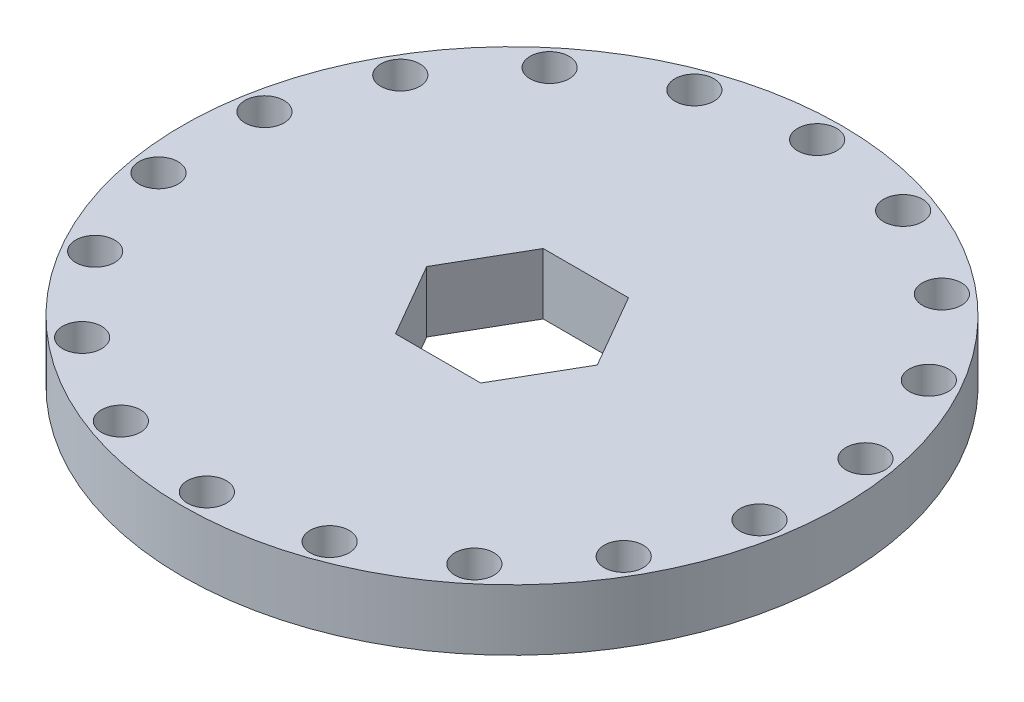
ISO-10303-21;
HEADER;
FILE_DESCRIPTION(('STEP AP214'),'2;1');
FILE_NAME('part.step','',(''),(''),'','','');
FILE_SCHEMA(('AUTOMOTIVE_DESIGN { 1 0 10303 214 1 1 1 1 }'));
ENDSEC;
DATA;
#1=APPLICATION_CONTEXT('core data for automotive mechanical design processes');
#2=APPLICATION_PROTOCOL_DEFINITION('international standard','automotive_design',2000,#1);
#3=PRODUCT_CONTEXT('',#1,'mechanical');
#4=PRODUCT('Part','Part','',(#3));
#5=PRODUCT_RELATED_PRODUCT_CATEGORY('part','',(#4));
#6=PRODUCT_DEFINITION_FORMATION('','',#4);
#7=PRODUCT_DEFINITION_CONTEXT('part definition',#1,'design');
#8=PRODUCT_DEFINITION('design','',#6,#7);
#9=PRODUCT_DEFINITION_SHAPE('','',#8);
#10=(LENGTH_UNIT() NAMED_UNIT(*) SI_UNIT(.MILLI.,.METRE.));
#11=(NAMED_UNIT(*) PLANE_ANGLE_UNIT() SI_UNIT($,.RADIAN.));
#12=(NAMED_UNIT(*) SI_UNIT($,.STERADIAN.) SOLID_ANGLE_UNIT());
#13=UNCERTAINTY_MEASURE_WITH_UNIT(LENGTH_MEASURE(1.E-05),#10,'distance_accuracy_value','');
#14=(GEOMETRIC_REPRESENTATION_CONTEXT(3) GLOBAL_UNCERTAINTY_ASSIGNED_CONTEXT((#13)) GLOBAL_UNIT_ASSIGNED_CONTEXT((#10,
#11,#12)) REPRESENTATION_CONTEXT('',''));
#15=CARTESIAN_POINT('',(0.,0.,0.));
#16=DIRECTION('',(0.,0.,1.));
#17=DIRECTION('',(1.,0.,0.));
#18=AXIS2_PLACEMENT_3D('',#15,#16,#17);
#19=CARTESIAN_POINT('',(0.,5.,0.));
#20=DIRECTION('',(0.,-1.,0.));
#21=DIRECTION('',(0.,0.,-1.));
#22=AXIS2_PLACEMENT_3D('',#19,#20,#21);
#23=CYLINDRICAL_SURFACE('',#22,27.);
#24=CARTESIAN_POINT('',(0.,5.,0.));
#25=DIRECTION('',(0.,1.,0.));
#26=DIRECTION('',(0.,0.,1.));
#27=AXIS2_PLACEMENT_3D('',#24,#25,#26);
#28=CIRCLE('',#27,27.);
#29=CARTESIAN_POINT('',(0.,5.,27.));
#30=VERTEX_POINT('',#29);
#31=EDGE_CURVE('E11',#30,#30,#28,.T.);
#32=ORIENTED_EDGE('',*,*,#31,.F.);
#33=EDGE_LOOP('',(#32));
#34=FACE_BOUND('',#33,.T.);
#35=CARTESIAN_POINT('',(0.,0.,0.));
#36=DIRECTION('',(0.,1.,0.));
#37=DIRECTION('',(0.,0.,1.));
#38=AXIS2_PLACEMENT_3D('',#35,#36,#37);
#39=CIRCLE('',#38,27.);
#40=CARTESIAN_POINT('',(0.,0.,27.));
#41=VERTEX_POINT('',#40);
#42=EDGE_CURVE('E45',#41,#41,#39,.T.);
#43=ORIENTED_EDGE('',*,*,#42,.T.);
#44=EDGE_LOOP('',(#43));
#45=FACE_BOUND('',#44,.T.);
#46=ADVANCED_FACE('F37',(#34,#45),#23,.T.);
#47=CARTESIAN_POINT('',(0.,5.,0.));
#48=DIRECTION('',(0.,1.,0.));
#49=DIRECTION('',(0.,0.,1.));
#50=AXIS2_PLACEMENT_3D('',#47,#48,#49);
#51=PLANE('',#50);
#52=CARTESIAN_POINT('',(-8.55050358314172,5.,-23.4923155196477));
#53=DIRECTION('',(0.,1.,0.));
#54=DIRECTION('',(0.,0.,1.));
#55=AXIS2_PLACEMENT_3D('',#52,#53,#54);
#56=CIRCLE('',#55,1.6);
#57=CARTESIAN_POINT('',(-8.55050358314172,5.,-21.8923155196477));
#58=VERTEX_POINT('',#57);
#59=EDGE_CURVE('E222',#58,#58,#56,.T.);
#60=ORIENTED_EDGE('',*,*,#59,.F.);
#61=EDGE_LOOP('',(#60));
#62=FACE_BOUND('',#61,.T.);
#63=CARTESIAN_POINT('',(-16.0696902421635,5.,-19.1511110779744));
#64=DIRECTION('',(0.,1.,0.));
#65=DIRECTION('',(0.,0.,1.));
#66=AXIS2_PLACEMENT_3D('',#63,#64,#65);
#67=CIRCLE('',#66,1.6);
#68=CARTESIAN_POINT('',(-16.0696902421635,5.,-17.5511110779744));
#69=VERTEX_POINT('',#68);
#70=EDGE_CURVE('E212',#69,#69,#67,.T.);
#71=ORIENTED_EDGE('',*,*,#70,.F.);
#72=EDGE_LOOP('',(#71));
#73=FACE_BOUND('',#72,.T.);
#74=CARTESIAN_POINT('',(-21.650635094611,5.,-12.5));
#75=DIRECTION('',(0.,1.,0.));
#76=DIRECTION('',(0.,0.,1.));
#77=AXIS2_PLACEMENT_3D('',#74,#75,#76);
#78=CIRCLE('',#77,1.6);
#79=CARTESIAN_POINT('',(-21.650635094611,5.,-10.9));
#80=VERTEX_POINT('',#79);
#81=EDGE_CURVE('E209',#80,#80,#78,.T.);
#82=ORIENTED_EDGE('',*,*,#81,.F.);
#83=EDGE_LOOP('',(#82));
#84=FACE_BOUND('',#83,.T.);
#85=CARTESIAN_POINT('',(-24.6201938253052,5.,-4.34120444167325));
#86=DIRECTION('',(0.,1.,0.));
#87=DIRECTION('',(0.,0.,1.));
#88=AXIS2_PLACEMENT_3D('',#85,#86,#87);
#89=CIRCLE('',#88,1.6);
#90=CARTESIAN_POINT('',(-24.6201938253052,5.,-2.74120444167325));
#91=VERTEX_POINT('',#90);
#92=EDGE_CURVE('E206',#91,#91,#89,.T.);
#93=ORIENTED_EDGE('',*,*,#92,.F.);
#94=EDGE_LOOP('',(#93));
#95=FACE_BOUND('',#94,.T.);
#96=CARTESIAN_POINT('',(-24.6201938253052,5.,4.34120444167328));
#97=DIRECTION('',(0.,1.,0.));
#98=DIRECTION('',(0.,0.,1.));
#99=AXIS2_PLACEMENT_3D('',#96,#97,#98);
#100=CIRCLE('',#99,1.6);
#101=CARTESIAN_POINT('',(-24.6201938253052,5.,5.94120444167328));
#102=VERTEX_POINT('',#101);
#103=EDGE_CURVE('E202',#102,#102,#100,.T.);
#104=ORIENTED_EDGE('',*,*,#103,.F.);
#105=EDGE_LOOP('',(#104));
#106=FACE_BOUND('',#105,.T.);
#107=CARTESIAN_POINT('',(-21.650635094611,5.,12.5));
#108=DIRECTION('',(0.,1.,0.));
#109=DIRECTION('',(0.,0.,1.));
#110=AXIS2_PLACEMENT_3D('',#107,#108,#109);
#111=CIRCLE('',#110,1.6);
#112=CARTESIAN_POINT('',(-21.650635094611,5.,14.1));
#113=VERTEX_POINT('',#112);
#114=EDGE_CURVE('E198',#113,#113,#111,.T.);
#115=ORIENTED_EDGE('',*,*,#114,.F.);
#116=EDGE_LOOP('',(#115));
#117=FACE_BOUND('',#116,.T.);
#118=CARTESIAN_POINT('',(-16.0696902421635,5.,19.1511110779745));
#119=DIRECTION('',(0.,1.,0.));
#120=DIRECTION('',(0.,0.,1.));
#121=AXIS2_PLACEMENT_3D('',#118,#119,#120);
#122=CIRCLE('',#121,1.6);
#123=CARTESIAN_POINT('',(-16.0696902421635,5.,20.7511110779745));
#124=VERTEX_POINT('',#123);
#125=EDGE_CURVE('E194',#124,#124,#122,.T.);
#126=ORIENTED_EDGE('',*,*,#125,.F.);
#127=EDGE_LOOP('',(#126));
#128=FACE_BOUND('',#127,.T.);
#129=CARTESIAN_POINT('',(-8.55050358314171,5.,23.4923155196477));
#130=DIRECTION('',(0.,1.,0.));
#131=DIRECTION('',(0.,0.,1.));
#132=AXIS2_PLACEMENT_3D('',#129,#130,#131);
#133=CIRCLE('',#132,1.6);
#134=CARTESIAN_POINT('',(-8.55050358314171,5.,25.0923155196477));
#135=VERTEX_POINT('',#134);
#136=EDGE_CURVE('E190',#135,#135,#133,.T.);
#137=ORIENTED_EDGE('',*,*,#136,.F.);
#138=EDGE_LOOP('',(#137));
#139=FACE_BOUND('',#138,.T.);
#140=CARTESIAN_POINT('',(0.,5.,25.));
#141=DIRECTION('',(0.,1.,0.));
#142=DIRECTION('',(0.,0.,1.));
#143=AXIS2_PLACEMENT_3D('',#140,#141,#142);
#144=CIRCLE('',#143,1.6);
#145=CARTESIAN_POINT('',(0.,5.,26.6));
#146=VERTEX_POINT('',#145);
#147=EDGE_CURVE('E186',#146,#146,#144,.T.);
#148=ORIENTED_EDGE('',*,*,#147,.F.);
#149=EDGE_LOOP('',(#148));
#150=FACE_BOUND('',#149,.T.);
#151=CARTESIAN_POINT('',(8.55050358314173,5.,23.4923155196477));
#152=DIRECTION('',(0.,1.,0.));
#153=DIRECTION('',(0.,0.,1.));
#154=AXIS2_PLACEMENT_3D('',#151,#152,#153);
#155=CIRCLE('',#154,1.6);
#156=CARTESIAN_POINT('',(8.55050358314173,5.,25.0923155196477));
#157=VERTEX_POINT('',#156);
#158=EDGE_CURVE('E182',#157,#157,#155,.T.);
#159=ORIENTED_EDGE('',*,*,#158,.F.);
#160=EDGE_LOOP('',(#159));
#161=FACE_BOUND('',#160,.T.);
#162=CARTESIAN_POINT('',(16.0696902421635,5.,19.1511110779745));
#163=DIRECTION('',(0.,1.,0.));
#164=DIRECTION('',(0.,0.,1.));
#165=AXIS2_PLACEMENT_3D('',#162,#163,#164);
#166=CIRCLE('',#165,1.6);
#167=CARTESIAN_POINT('',(16.0696902421635,5.,20.7511110779745));
#168=VERTEX_POINT('',#167);
#169=EDGE_CURVE('E178',#168,#168,#166,.T.);
#170=ORIENTED_EDGE('',*,*,#169,.F.);
#171=EDGE_LOOP('',(#170));
#172=FACE_BOUND('',#171,.T.);
#173=CARTESIAN_POINT('',(21.650635094611,5.,12.5));
#174=DIRECTION('',(0.,1.,0.));
#175=DIRECTION('',(0.,0.,1.));
#176=AXIS2_PLACEMENT_3D('',#173,#174,#175);
#177=CIRCLE('',#176,1.6);
#178=CARTESIAN_POINT('',(21.650635094611,5.,14.1));
#179=VERTEX_POINT('',#178);
#180=EDGE_CURVE('E174',#179,#179,#177,.T.);
#181=ORIENTED_EDGE('',*,*,#180,.F.);
#182=EDGE_LOOP('',(#181));
#183=FACE_BOUND('',#182,.T.);
#184=CARTESIAN_POINT('',(24.6201938253052,5.,4.34120444167326));
#185=DIRECTION('',(0.,1.,0.));
#186=DIRECTION('',(0.,0.,1.));
#187=AXIS2_PLACEMENT_3D('',#184,#185,#186);
#188=CIRCLE('',#187,1.6);
#189=CARTESIAN_POINT('',(24.6201938253052,5.,5.94120444167326));
#190=VERTEX_POINT('',#189);
#191=EDGE_CURVE('E170',#190,#190,#188,.T.);
#192=ORIENTED_EDGE('',*,*,#191,.F.);
#193=EDGE_LOOP('',(#192));
#194=FACE_BOUND('',#193,.T.);
#195=CARTESIAN_POINT('',(24.6201938253052,5.,-4.34120444167327));
#196=DIRECTION('',(0.,1.,0.));
#197=DIRECTION('',(0.,0.,1.));
#198=AXIS2_PLACEMENT_3D('',#195,#196,#197);
#199=CIRCLE('',#198,1.6);
#200=CARTESIAN_POINT('',(24.6201938253052,5.,-2.74120444167327));
#201=VERTEX_POINT('',#200);
#202=EDGE_CURVE('E166',#201,#201,#199,.T.);
#203=ORIENTED_EDGE('',*,*,#202,.F.);
#204=EDGE_LOOP('',(#203));
#205=FACE_BOUND('',#204,.T.);
#206=CARTESIAN_POINT('',(21.650635094611,5.,-12.5));
#207=DIRECTION('',(0.,1.,0.));
#208=DIRECTION('',(0.,0.,1.));
#209=AXIS2_PLACEMENT_3D('',#206,#207,#208);
#210=CIRCLE('',#209,1.6);
#211=CARTESIAN_POINT('',(21.650635094611,5.,-10.9));
#212=VERTEX_POINT('',#211);
#213=EDGE_CURVE('E162',#212,#212,#210,.T.);
#214=ORIENTED_EDGE('',*,*,#213,.F.);
#215=EDGE_LOOP('',(#214));
#216=FACE_BOUND('',#215,.T.);
#217=CARTESIAN_POINT('',(16.0696902421635,5.,-19.1511110779745));
#218=DIRECTION('',(0.,1.,0.));
#219=DIRECTION('',(0.,0.,1.));
#220=AXIS2_PLACEMENT_3D('',#217,#218,#219);
#221=CIRCLE('',#220,1.6);
#222=CARTESIAN_POINT('',(16.0696902421635,5.,-17.5511110779745));
#223=VERTEX_POINT('',#222);
#224=EDGE_CURVE('E158',#223,#223,#221,.T.);
#225=ORIENTED_EDGE('',*,*,#224,.F.);
#226=EDGE_LOOP('',(#225));
#227=FACE_BOUND('',#226,.T.);
#228=CARTESIAN_POINT('',(8.55050358314173,5.,-23.4923155196477));
#229=DIRECTION('',(0.,1.,0.));
#230=DIRECTION('',(0.,0.,1.));
#231=AXIS2_PLACEMENT_3D('',#228,#229,#230);
#232=CIRCLE('',#231,1.6);
#233=CARTESIAN_POINT('',(8.55050358314173,5.,-21.8923155196477));
#234=VERTEX_POINT('',#233);
#235=EDGE_CURVE('E154',#234,#234,#232,.T.);
#236=ORIENTED_EDGE('',*,*,#235,.F.);
#237=EDGE_LOOP('',(#236));
#238=FACE_BOUND('',#237,.T.);
#239=CARTESIAN_POINT('',(0.,5.,-25.));
#240=DIRECTION('',(0.,1.,0.));
#241=DIRECTION('',(0.,0.,1.));
#242=AXIS2_PLACEMENT_3D('',#239,#240,#241);
#243=CIRCLE('',#242,1.6);
#244=CARTESIAN_POINT('',(0.,5.,-23.4));
#245=VERTEX_POINT('',#244);
#246=EDGE_CURVE('E116',#245,#245,#243,.T.);
#247=ORIENTED_EDGE('',*,*,#246,.F.);
#248=EDGE_LOOP('',(#247));
#249=FACE_BOUND('',#248,.T.);
#250=DIRECTION('',(0.5,0.,0.866025403784439));
#251=VECTOR('',#250,1.);
#252=CARTESIAN_POINT('',(-6.98593825719447,5.,0.));
#253=LINE('',#252,#251);
#254=CARTESIAN_POINT('',(-6.98593825719447,5.,0.));
#255=VERTEX_POINT('',#254);
#256=CARTESIAN_POINT('',(-3.49296912859724,5.,6.05));
#257=VERTEX_POINT('',#256);
#258=EDGE_CURVE('E53',#255,#257,#253,.T.);
#259=ORIENTED_EDGE('',*,*,#258,.F.);
#260=DIRECTION('',(-0.5,0.,0.866025403784439));
#261=VECTOR('',#260,1.);
#262=CARTESIAN_POINT('',(-3.49296912859724,5.,-6.05));
#263=LINE('',#262,#261);
#264=CARTESIAN_POINT('',(-3.49296912859724,5.,-6.05));
#265=VERTEX_POINT('',#264);
#266=EDGE_CURVE('E110',#265,#255,#263,.T.);
#267=ORIENTED_EDGE('',*,*,#266,.F.);
#268=DIRECTION('',(-1.,0.,0.));
#269=VECTOR('',#268,1.);
#270=CARTESIAN_POINT('',(3.49296912859723,5.,-6.05));
#271=LINE('',#270,#269);
#272=CARTESIAN_POINT('',(3.49296912859723,5.,-6.05));
#273=VERTEX_POINT('',#272);
#274=EDGE_CURVE('E113',#273,#265,#271,.T.);
#275=ORIENTED_EDGE('',*,*,#274,.F.);
#276=DIRECTION('',(-0.5,0.,-0.866025403784439));
#277=VECTOR('',#276,1.);
#278=CARTESIAN_POINT('',(6.98593825719447,5.,0.));
#279=LINE('',#278,#277);
#280=CARTESIAN_POINT('',(6.98593825719447,5.,0.));
#281=VERTEX_POINT('',#280);
#282=EDGE_CURVE('E133',#281,#273,#279,.T.);
#283=ORIENTED_EDGE('',*,*,#282,.F.);
#284=DIRECTION('',(0.5,0.,-0.866025403784439));
#285=VECTOR('',#284,1.);
#286=CARTESIAN_POINT('',(3.49296912859723,5.,6.05));
#287=LINE('',#286,#285);
#288=CARTESIAN_POINT('',(3.49296912859723,5.,6.05));
#289=VERTEX_POINT('',#288);
#290=EDGE_CURVE('E130',#289,#281,#287,.T.);
#291=ORIENTED_EDGE('',*,*,#290,.F.);
#292=DIRECTION('',(1.,0.,0.));
#293=VECTOR('',#292,1.);
#294=CARTESIAN_POINT('',(-3.49296912859724,5.,6.05));
#295=LINE('',#294,#293);
#296=EDGE_CURVE('E127',#257,#289,#295,.T.);
#297=ORIENTED_EDGE('',*,*,#296,.F.);
#298=EDGE_LOOP('',(#259,#267,#275,#283,#291,#297));
#299=FACE_BOUND('',#298,.T.);
#300=ORIENTED_EDGE('',*,*,#31,.T.);
#301=EDGE_LOOP('',(#300));
#302=FACE_BOUND('',#301,.T.);
#303=ADVANCED_FACE('F256',(#62,#73,#84,#95,#106,#117,#128,#139,#150,#161,#172,#183,#194,#205,
#216,#227,#238,#249,#299,#302),#51,.T.);
#304=CARTESIAN_POINT('',(0.,0.,0.));
#305=DIRECTION('',(0.,1.,0.));
#306=DIRECTION('',(0.,0.,1.));
#307=AXIS2_PLACEMENT_3D('',#304,#305,#306);
#308=PLANE('',#307);
#309=CARTESIAN_POINT('',(-8.55050358314172,0.,-23.4923155196477));
#310=DIRECTION('',(0.,1.,0.));
#311=DIRECTION('',(0.,0.,1.));
#312=AXIS2_PLACEMENT_3D('',#309,#310,#311);
#313=CIRCLE('',#312,1.6);
#314=CARTESIAN_POINT('',(-8.55050358314172,0.,-21.8923155196477));
#315=VERTEX_POINT('',#314);
#316=EDGE_CURVE('E40',#315,#315,#313,.T.);
#317=ORIENTED_EDGE('',*,*,#316,.T.);
#318=EDGE_LOOP('',(#317));
#319=FACE_BOUND('',#318,.T.);
#320=CARTESIAN_POINT('',(-16.0696902421635,0.,-19.1511110779744));
#321=DIRECTION('',(0.,1.,0.));
#322=DIRECTION('',(0.,0.,1.));
#323=AXIS2_PLACEMENT_3D('',#320,#321,#322);
#324=CIRCLE('',#323,1.6);
#325=CARTESIAN_POINT('',(-16.0696902421635,0.,-17.5511110779744));
#326=VERTEX_POINT('',#325);
#327=EDGE_CURVE('E210',#326,#326,#324,.T.);
#328=ORIENTED_EDGE('',*,*,#327,.T.);
#329=EDGE_LOOP('',(#328));
#330=FACE_BOUND('',#329,.T.);
#331=CARTESIAN_POINT('',(-21.650635094611,0.,-12.5));
#332=DIRECTION('',(0.,1.,0.));
#333=DIRECTION('',(0.,0.,1.));
#334=AXIS2_PLACEMENT_3D('',#331,#332,#333);
#335=CIRCLE('',#334,1.6);
#336=CARTESIAN_POINT('',(-21.650635094611,0.,-10.9));
#337=VERTEX_POINT('',#336);
#338=EDGE_CURVE('E207',#337,#337,#335,.T.);
#339=ORIENTED_EDGE('',*,*,#338,.T.);
#340=EDGE_LOOP('',(#339));
#341=FACE_BOUND('',#340,.T.);
#342=CARTESIAN_POINT('',(-24.6201938253052,0.,-4.34120444167325));
#343=DIRECTION('',(0.,1.,0.));
#344=DIRECTION('',(0.,0.,1.));
#345=AXIS2_PLACEMENT_3D('',#342,#343,#344);
#346=CIRCLE('',#345,1.6);
#347=CARTESIAN_POINT('',(-24.6201938253052,0.,-2.74120444167325));
#348=VERTEX_POINT('',#347);
#349=EDGE_CURVE('E203',#348,#348,#346,.T.);
#350=ORIENTED_EDGE('',*,*,#349,.T.);
#351=EDGE_LOOP('',(#350));
#352=FACE_BOUND('',#351,.T.);
#353=CARTESIAN_POINT('',(-24.6201938253052,0.,4.34120444167328));
#354=DIRECTION('',(0.,1.,0.));
#355=DIRECTION('',(0.,0.,1.));
#356=AXIS2_PLACEMENT_3D('',#353,#354,#355);
#357=CIRCLE('',#356,1.6);
#358=CARTESIAN_POINT('',(-24.6201938253052,0.,5.94120444167328));
#359=VERTEX_POINT('',#358);
#360=EDGE_CURVE('E199',#359,#359,#357,.T.);
#361=ORIENTED_EDGE('',*,*,#360,.T.);
#362=EDGE_LOOP('',(#361));
#363=FACE_BOUND('',#362,.T.);
#364=CARTESIAN_POINT('',(-21.650635094611,0.,12.5));
#365=DIRECTION('',(0.,1.,0.));
#366=DIRECTION('',(0.,0.,1.));
#367=AXIS2_PLACEMENT_3D('',#364,#365,#366);
#368=CIRCLE('',#367,1.6);
#369=CARTESIAN_POINT('',(-21.650635094611,0.,14.1));
#370=VERTEX_POINT('',#369);
#371=EDGE_CURVE('E195',#370,#370,#368,.T.);
#372=ORIENTED_EDGE('',*,*,#371,.T.);
#373=EDGE_LOOP('',(#372));
#374=FACE_BOUND('',#373,.T.);
#375=CARTESIAN_POINT('',(-16.0696902421635,0.,19.1511110779745));
#376=DIRECTION('',(0.,1.,0.));
#377=DIRECTION('',(0.,0.,1.));
#378=AXIS2_PLACEMENT_3D('',#375,#376,#377);
#379=CIRCLE('',#378,1.6);
#380=CARTESIAN_POINT('',(-16.0696902421635,0.,20.7511110779745));
#381=VERTEX_POINT('',#380);
#382=EDGE_CURVE('E191',#381,#381,#379,.T.);
#383=ORIENTED_EDGE('',*,*,#382,.T.);
#384=EDGE_LOOP('',(#383));
#385=FACE_BOUND('',#384,.T.);
#386=CARTESIAN_POINT('',(-8.55050358314171,0.,23.4923155196477));
#387=DIRECTION('',(0.,1.,0.));
#388=DIRECTION('',(0.,0.,1.));
#389=AXIS2_PLACEMENT_3D('',#386,#387,#388);
#390=CIRCLE('',#389,1.6);
#391=CARTESIAN_POINT('',(-8.55050358314171,0.,25.0923155196477));
#392=VERTEX_POINT('',#391);
#393=EDGE_CURVE('E187',#392,#392,#390,.T.);
#394=ORIENTED_EDGE('',*,*,#393,.T.);
#395=EDGE_LOOP('',(#394));
#396=FACE_BOUND('',#395,.T.);
#397=CARTESIAN_POINT('',(0.,0.,25.));
#398=DIRECTION('',(0.,1.,0.));
#399=DIRECTION('',(0.,0.,1.));
#400=AXIS2_PLACEMENT_3D('',#397,#398,#399);
#401=CIRCLE('',#400,1.6);
#402=CARTESIAN_POINT('',(0.,0.,26.6));
#403=VERTEX_POINT('',#402);
#404=EDGE_CURVE('E183',#403,#403,#401,.T.);
#405=ORIENTED_EDGE('',*,*,#404,.T.);
#406=EDGE_LOOP('',(#405));
#407=FACE_BOUND('',#406,.T.);
#408=CARTESIAN_POINT('',(8.55050358314173,0.,23.4923155196477));
#409=DIRECTION('',(0.,1.,0.));
#410=DIRECTION('',(0.,0.,1.));
#411=AXIS2_PLACEMENT_3D('',#408,#409,#410);
#412=CIRCLE('',#411,1.6);
#413=CARTESIAN_POINT('',(8.55050358314173,0.,25.0923155196477));
#414=VERTEX_POINT('',#413);
#415=EDGE_CURVE('E179',#414,#414,#412,.T.);
#416=ORIENTED_EDGE('',*,*,#415,.T.);
#417=EDGE_LOOP('',(#416));
#418=FACE_BOUND('',#417,.T.);
#419=CARTESIAN_POINT('',(16.0696902421635,0.,19.1511110779745));
#420=DIRECTION('',(0.,1.,0.));
#421=DIRECTION('',(0.,0.,1.));
#422=AXIS2_PLACEMENT_3D('',#419,#420,#421);
#423=CIRCLE('',#422,1.6);
#424=CARTESIAN_POINT('',(16.0696902421635,0.,20.7511110779745));
#425=VERTEX_POINT('',#424);
#426=EDGE_CURVE('E175',#425,#425,#423,.T.);
#427=ORIENTED_EDGE('',*,*,#426,.T.);
#428=EDGE_LOOP('',(#427));
#429=FACE_BOUND('',#428,.T.);
#430=CARTESIAN_POINT('',(21.650635094611,0.,12.5));
#431=DIRECTION('',(0.,1.,0.));
#432=DIRECTION('',(0.,0.,1.));
#433=AXIS2_PLACEMENT_3D('',#430,#431,#432);
#434=CIRCLE('',#433,1.6);
#435=CARTESIAN_POINT('',(21.650635094611,0.,14.1));
#436=VERTEX_POINT('',#435);
#437=EDGE_CURVE('E171',#436,#436,#434,.T.);
#438=ORIENTED_EDGE('',*,*,#437,.T.);
#439=EDGE_LOOP('',(#438));
#440=FACE_BOUND('',#439,.T.);
#441=CARTESIAN_POINT('',(24.6201938253052,0.,4.34120444167326));
#442=DIRECTION('',(0.,1.,0.));
#443=DIRECTION('',(0.,0.,1.));
#444=AXIS2_PLACEMENT_3D('',#441,#442,#443);
#445=CIRCLE('',#444,1.6);
#446=CARTESIAN_POINT('',(24.6201938253052,0.,5.94120444167326));
#447=VERTEX_POINT('',#446);
#448=EDGE_CURVE('E167',#447,#447,#445,.T.);
#449=ORIENTED_EDGE('',*,*,#448,.T.);
#450=EDGE_LOOP('',(#449));
#451=FACE_BOUND('',#450,.T.);
#452=CARTESIAN_POINT('',(24.6201938253052,0.,-4.34120444167327));
#453=DIRECTION('',(0.,1.,0.));
#454=DIRECTION('',(0.,0.,1.));
#455=AXIS2_PLACEMENT_3D('',#452,#453,#454);
#456=CIRCLE('',#455,1.6);
#457=CARTESIAN_POINT('',(24.6201938253052,0.,-2.74120444167327));
#458=VERTEX_POINT('',#457);
#459=EDGE_CURVE('E163',#458,#458,#456,.T.);
#460=ORIENTED_EDGE('',*,*,#459,.T.);
#461=EDGE_LOOP('',(#460));
#462=FACE_BOUND('',#461,.T.);
#463=CARTESIAN_POINT('',(21.650635094611,0.,-12.5));
#464=DIRECTION('',(0.,1.,0.));
#465=DIRECTION('',(0.,0.,1.));
#466=AXIS2_PLACEMENT_3D('',#463,#464,#465);
#467=CIRCLE('',#466,1.6);
#468=CARTESIAN_POINT('',(21.650635094611,0.,-10.9));
#469=VERTEX_POINT('',#468);
#470=EDGE_CURVE('E159',#469,#469,#467,.T.);
#471=ORIENTED_EDGE('',*,*,#470,.T.);
#472=EDGE_LOOP('',(#471));
#473=FACE_BOUND('',#472,.T.);
#474=CARTESIAN_POINT('',(16.0696902421635,0.,-19.1511110779745));
#475=DIRECTION('',(0.,1.,0.));
#476=DIRECTION('',(0.,0.,1.));
#477=AXIS2_PLACEMENT_3D('',#474,#475,#476);
#478=CIRCLE('',#477,1.6);
#479=CARTESIAN_POINT('',(16.0696902421635,0.,-17.5511110779745));
#480=VERTEX_POINT('',#479);
#481=EDGE_CURVE('E155',#480,#480,#478,.T.);
#482=ORIENTED_EDGE('',*,*,#481,.T.);
#483=EDGE_LOOP('',(#482));
#484=FACE_BOUND('',#483,.T.);
#485=CARTESIAN_POINT('',(8.55050358314173,0.,-23.4923155196477));
#486=DIRECTION('',(0.,1.,0.));
#487=DIRECTION('',(0.,0.,1.));
#488=AXIS2_PLACEMENT_3D('',#485,#486,#487);
#489=CIRCLE('',#488,1.6);
#490=CARTESIAN_POINT('',(8.55050358314173,0.,-21.8923155196477));
#491=VERTEX_POINT('',#490);
#492=EDGE_CURVE('E151',#491,#491,#489,.T.);
#493=ORIENTED_EDGE('',*,*,#492,.T.);
#494=EDGE_LOOP('',(#493));
#495=FACE_BOUND('',#494,.T.);
#496=CARTESIAN_POINT('',(0.,0.,-25.));
#497=DIRECTION('',(0.,1.,0.));
#498=DIRECTION('',(0.,0.,1.));
#499=AXIS2_PLACEMENT_3D('',#496,#497,#498);
#500=CIRCLE('',#499,1.6);
#501=CARTESIAN_POINT('',(0.,0.,-23.4));
#502=VERTEX_POINT('',#501);
#503=EDGE_CURVE('E128',#502,#502,#500,.T.);
#504=ORIENTED_EDGE('',*,*,#503,.T.);
#505=EDGE_LOOP('',(#504));
#506=FACE_BOUND('',#505,.T.);
#507=DIRECTION('',(-0.5,0.,0.866025403784439));
#508=VECTOR('',#507,1.);
#509=CARTESIAN_POINT('',(-3.49296912859724,0.,-6.05));
#510=LINE('',#509,#508);
#511=CARTESIAN_POINT('',(-3.49296912859724,0.,-6.05));
#512=VERTEX_POINT('',#511);
#513=CARTESIAN_POINT('',(-6.98593825719447,0.,0.));
#514=VERTEX_POINT('',#513);
#515=EDGE_CURVE('E99',#512,#514,#510,.T.);
#516=ORIENTED_EDGE('',*,*,#515,.T.);
#517=DIRECTION('',(0.5,0.,0.866025403784439));
#518=VECTOR('',#517,1.);
#519=CARTESIAN_POINT('',(-6.98593825719447,0.,0.));
#520=LINE('',#519,#518);
#521=CARTESIAN_POINT('',(-3.49296912859724,0.,6.05));
#522=VERTEX_POINT('',#521);
#523=EDGE_CURVE('E93',#514,#522,#520,.T.);
#524=ORIENTED_EDGE('',*,*,#523,.T.);
#525=DIRECTION('',(1.,0.,0.));
#526=VECTOR('',#525,1.);
#527=CARTESIAN_POINT('',(-3.49296912859724,0.,6.05));
#528=LINE('',#527,#526);
#529=CARTESIAN_POINT('',(3.49296912859723,0.,6.05));
#530=VERTEX_POINT('',#529);
#531=EDGE_CURVE('E102',#522,#530,#528,.T.);
#532=ORIENTED_EDGE('',*,*,#531,.T.);
#533=DIRECTION('',(0.5,0.,-0.866025403784439));
#534=VECTOR('',#533,1.);
#535=CARTESIAN_POINT('',(3.49296912859723,0.,6.05));
#536=LINE('',#535,#534);
#537=CARTESIAN_POINT('',(6.98593825719447,0.,0.));
#538=VERTEX_POINT('',#537);
#539=EDGE_CURVE('E61',#530,#538,#536,.T.);
#540=ORIENTED_EDGE('',*,*,#539,.T.);
#541=DIRECTION('',(-0.5,0.,-0.866025403784439));
#542=VECTOR('',#541,1.);
#543=CARTESIAN_POINT('',(6.98593825719447,0.,0.));
#544=LINE('',#543,#542);
#545=CARTESIAN_POINT('',(3.49296912859723,0.,-6.05));
#546=VERTEX_POINT('',#545);
#547=EDGE_CURVE('E120',#538,#546,#544,.T.);
#548=ORIENTED_EDGE('',*,*,#547,.T.);
#549=DIRECTION('',(-1.,0.,0.));
#550=VECTOR('',#549,1.);
#551=CARTESIAN_POINT('',(3.49296912859723,0.,-6.05));
#552=LINE('',#551,#550);
#553=EDGE_CURVE('E123',#546,#512,#552,.T.);
#554=ORIENTED_EDGE('',*,*,#553,.T.);
#555=EDGE_LOOP('',(#516,#524,#532,#540,#548,#554));
#556=FACE_BOUND('',#555,.T.);
#557=ORIENTED_EDGE('',*,*,#42,.F.);
#558=EDGE_LOOP('',(#557));
#559=FACE_BOUND('',#558,.T.);
#560=ADVANCED_FACE('F106',(#319,#330,#341,#352,#363,#374,#385,#396,#407,#418,#429,#440,#451,
#462,#473,#484,#495,#506,#556,#559),#308,.F.);
#561=CARTESIAN_POINT('',(-6.98593825719447,0.,0.));
#562=DIRECTION('',(-0.866025403784439,0.,0.5));
#563=DIRECTION('',(0.5,0.,0.866025403784439));
#564=AXIS2_PLACEMENT_3D('',#561,#562,#563);
#565=PLANE('',#564);
#566=ORIENTED_EDGE('',*,*,#258,.T.);
#567=DIRECTION('',(0.,1.,0.));
#568=VECTOR('',#567,1.);
#569=CARTESIAN_POINT('',(-3.49296912859724,0.,6.05));
#570=LINE('',#569,#568);
#571=EDGE_CURVE('E89',#522,#257,#570,.T.);
#572=ORIENTED_EDGE('',*,*,#571,.F.);
#573=ORIENTED_EDGE('',*,*,#523,.F.);
#574=DIRECTION('',(0.,1.,0.));
#575=VECTOR('',#574,1.);
#576=CARTESIAN_POINT('',(-6.98593825719447,0.,0.));
#577=LINE('',#576,#575);
#578=EDGE_CURVE('E138',#514,#255,#577,.T.);
#579=ORIENTED_EDGE('',*,*,#578,.T.);
#580=EDGE_LOOP('',(#566,#572,#573,#579));
#581=FACE_BOUND('',#580,.T.);
#582=ADVANCED_FACE('F91',(#581),#565,.F.);
#583=CARTESIAN_POINT('',(-3.49296912859724,0.,-6.05));
#584=DIRECTION('',(-0.866025403784439,0.,-0.5));
#585=DIRECTION('',(-0.5,0.,0.866025403784439));
#586=AXIS2_PLACEMENT_3D('',#583,#584,#585);
#587=PLANE('',#586);
#588=ORIENTED_EDGE('',*,*,#266,.T.);
#589=ORIENTED_EDGE('',*,*,#578,.F.);
#590=ORIENTED_EDGE('',*,*,#515,.F.);
#591=DIRECTION('',(0.,1.,0.));
#592=VECTOR('',#591,1.);
#593=CARTESIAN_POINT('',(-3.49296912859724,0.,-6.05));
#594=LINE('',#593,#592);
#595=EDGE_CURVE('E140',#512,#265,#594,.T.);
#596=ORIENTED_EDGE('',*,*,#595,.T.);
#597=EDGE_LOOP('',(#588,#589,#590,#596));
#598=FACE_BOUND('',#597,.T.);
#599=ADVANCED_FACE('F276',(#598),#587,.F.);
#600=CARTESIAN_POINT('',(3.49296912859723,0.,-6.05));
#601=DIRECTION('',(0.,0.,-1.));
#602=DIRECTION('',(-1.,0.,0.));
#603=AXIS2_PLACEMENT_3D('',#600,#601,#602);
#604=PLANE('',#603);
#605=ORIENTED_EDGE('',*,*,#274,.T.);
#606=ORIENTED_EDGE('',*,*,#595,.F.);
#607=ORIENTED_EDGE('',*,*,#553,.F.);
#608=DIRECTION('',(0.,1.,0.));
#609=VECTOR('',#608,1.);
#610=CARTESIAN_POINT('',(3.49296912859723,0.,-6.05));
#611=LINE('',#610,#609);
#612=EDGE_CURVE('E142',#546,#273,#611,.T.);
#613=ORIENTED_EDGE('',*,*,#612,.T.);
#614=EDGE_LOOP('',(#605,#606,#607,#613));
#615=FACE_BOUND('',#614,.T.);
#616=ADVANCED_FACE('F288',(#615),#604,.F.);
#617=CARTESIAN_POINT('',(6.98593825719447,0.,0.));
#618=DIRECTION('',(0.866025403784439,0.,-0.5));
#619=DIRECTION('',(-0.5,0.,-0.866025403784439));
#620=AXIS2_PLACEMENT_3D('',#617,#618,#619);
#621=PLANE('',#620);
#622=ORIENTED_EDGE('',*,*,#282,.T.);
#623=ORIENTED_EDGE('',*,*,#612,.F.);
#624=ORIENTED_EDGE('',*,*,#547,.F.);
#625=DIRECTION('',(0.,1.,0.));
#626=VECTOR('',#625,1.);
#627=CARTESIAN_POINT('',(6.98593825719447,0.,0.));
#628=LINE('',#627,#626);
#629=EDGE_CURVE('E144',#538,#281,#628,.T.);
#630=ORIENTED_EDGE('',*,*,#629,.T.);
#631=EDGE_LOOP('',(#622,#623,#624,#630));
#632=FACE_BOUND('',#631,.T.);
#633=ADVANCED_FACE('F285',(#632),#621,.F.);
#634=CARTESIAN_POINT('',(3.49296912859723,0.,6.05));
#635=DIRECTION('',(0.866025403784439,0.,0.5));
#636=DIRECTION('',(0.5,0.,-0.866025403784439));
#637=AXIS2_PLACEMENT_3D('',#634,#635,#636);
#638=PLANE('',#637);
#639=ORIENTED_EDGE('',*,*,#290,.T.);
#640=ORIENTED_EDGE('',*,*,#629,.F.);
#641=ORIENTED_EDGE('',*,*,#539,.F.);
#642=DIRECTION('',(0.,1.,0.));
#643=VECTOR('',#642,1.);
#644=CARTESIAN_POINT('',(3.49296912859723,0.,6.05));
#645=LINE('',#644,#643);
#646=EDGE_CURVE('E98',#530,#289,#645,.T.);
#647=ORIENTED_EDGE('',*,*,#646,.T.);
#648=EDGE_LOOP('',(#639,#640,#641,#647));
#649=FACE_BOUND('',#648,.T.);
#650=ADVANCED_FACE('F282',(#649),#638,.F.);
#651=CARTESIAN_POINT('',(-3.49296912859724,0.,6.05));
#652=DIRECTION('',(0.,0.,1.));
#653=DIRECTION('',(1.,0.,0.));
#654=AXIS2_PLACEMENT_3D('',#651,#652,#653);
#655=PLANE('',#654);
#656=ORIENTED_EDGE('',*,*,#296,.T.);
#657=ORIENTED_EDGE('',*,*,#646,.F.);
#658=ORIENTED_EDGE('',*,*,#531,.F.);
#659=ORIENTED_EDGE('',*,*,#571,.T.);
#660=EDGE_LOOP('',(#656,#657,#658,#659));
#661=FACE_BOUND('',#660,.T.);
#662=ADVANCED_FACE('F103',(#661),#655,.F.);
#663=CARTESIAN_POINT('',(0.,-5.,-25.));
#664=DIRECTION('',(0.,1.,0.));
#665=DIRECTION('',(0.,0.,1.));
#666=AXIS2_PLACEMENT_3D('',#663,#664,#665);
#667=CYLINDRICAL_SURFACE('',#666,1.6);
#668=ORIENTED_EDGE('',*,*,#246,.T.);
#669=EDGE_LOOP('',(#668));
#670=FACE_BOUND('',#669,.T.);
#671=ORIENTED_EDGE('',*,*,#503,.F.);
#672=EDGE_LOOP('',(#671));
#673=FACE_BOUND('',#672,.T.);
#674=ADVANCED_FACE('F281',(#670,#673),#667,.F.);
#675=CARTESIAN_POINT('',(8.55050358314173,-5.,-23.4923155196477));
#676=DIRECTION('',(0.,1.,0.));
#677=DIRECTION('',(0.,0.,1.));
#678=AXIS2_PLACEMENT_3D('',#675,#676,#677);
#679=CYLINDRICAL_SURFACE('',#678,1.6);
#680=ORIENTED_EDGE('',*,*,#235,.T.);
#681=EDGE_LOOP('',(#680));
#682=FACE_BOUND('',#681,.T.);
#683=ORIENTED_EDGE('',*,*,#492,.F.);
#684=EDGE_LOOP('',(#683));
#685=FACE_BOUND('',#684,.T.);
#686=ADVANCED_FACE('F253',(#682,#685),#679,.F.);
#687=CARTESIAN_POINT('',(16.0696902421635,-5.,-19.1511110779745));
#688=DIRECTION('',(0.,1.,0.));
#689=DIRECTION('',(0.,0.,1.));
#690=AXIS2_PLACEMENT_3D('',#687,#688,#689);
#691=CYLINDRICAL_SURFACE('',#690,1.6);
#692=ORIENTED_EDGE('',*,*,#224,.T.);
#693=EDGE_LOOP('',(#692));
#694=FACE_BOUND('',#693,.T.);
#695=ORIENTED_EDGE('',*,*,#481,.F.);
#696=EDGE_LOOP('',(#695));
#697=FACE_BOUND('',#696,.T.);
#698=ADVANCED_FACE('F301',(#694,#697),#691,.F.);
#699=CARTESIAN_POINT('',(21.650635094611,-5.,-12.5));
#700=DIRECTION('',(0.,1.,0.));
#701=DIRECTION('',(0.,0.,1.));
#702=AXIS2_PLACEMENT_3D('',#699,#700,#701);
#703=CYLINDRICAL_SURFACE('',#702,1.6);
#704=ORIENTED_EDGE('',*,*,#213,.T.);
#705=EDGE_LOOP('',(#704));
#706=FACE_BOUND('',#705,.T.);
#707=ORIENTED_EDGE('',*,*,#470,.F.);
#708=EDGE_LOOP('',(#707));
#709=FACE_BOUND('',#708,.T.);
#710=ADVANCED_FACE('F304',(#706,#709),#703,.F.);
#711=CARTESIAN_POINT('',(24.6201938253052,-5.,-4.34120444167327));
#712=DIRECTION('',(0.,1.,0.));
#713=DIRECTION('',(0.,0.,1.));
#714=AXIS2_PLACEMENT_3D('',#711,#712,#713);
#715=CYLINDRICAL_SURFACE('',#714,1.6);
#716=ORIENTED_EDGE('',*,*,#202,.T.);
#717=EDGE_LOOP('',(#716));
#718=FACE_BOUND('',#717,.T.);
#719=ORIENTED_EDGE('',*,*,#459,.F.);
#720=EDGE_LOOP('',(#719));
#721=FACE_BOUND('',#720,.T.);
#722=ADVANCED_FACE('F308',(#718,#721),#715,.F.);
#723=CARTESIAN_POINT('',(24.6201938253052,-5.,4.34120444167326));
#724=DIRECTION('',(0.,1.,0.));
#725=DIRECTION('',(0.,0.,1.));
#726=AXIS2_PLACEMENT_3D('',#723,#724,#725);
#727=CYLINDRICAL_SURFACE('',#726,1.6);
#728=ORIENTED_EDGE('',*,*,#191,.T.);
#729=EDGE_LOOP('',(#728));
#730=FACE_BOUND('',#729,.T.);
#731=ORIENTED_EDGE('',*,*,#448,.F.);
#732=EDGE_LOOP('',(#731));
#733=FACE_BOUND('',#732,.T.);
#734=ADVANCED_FACE('F312',(#730,#733),#727,.F.);
#735=CARTESIAN_POINT('',(21.650635094611,-5.,12.5));
#736=DIRECTION('',(0.,1.,0.));
#737=DIRECTION('',(0.,0.,1.));
#738=AXIS2_PLACEMENT_3D('',#735,#736,#737);
#739=CYLINDRICAL_SURFACE('',#738,1.6);
#740=ORIENTED_EDGE('',*,*,#180,.T.);
#741=EDGE_LOOP('',(#740));
#742=FACE_BOUND('',#741,.T.);
#743=ORIENTED_EDGE('',*,*,#437,.F.);
#744=EDGE_LOOP('',(#743));
#745=FACE_BOUND('',#744,.T.);
#746=ADVANCED_FACE('F316',(#742,#745),#739,.F.);
#747=CARTESIAN_POINT('',(16.0696902421635,-5.,19.1511110779745));
#748=DIRECTION('',(0.,1.,0.));
#749=DIRECTION('',(0.,0.,1.));
#750=AXIS2_PLACEMENT_3D('',#747,#748,#749);
#751=CYLINDRICAL_SURFACE('',#750,1.6);
#752=ORIENTED_EDGE('',*,*,#169,.T.);
#753=EDGE_LOOP('',(#752));
#754=FACE_BOUND('',#753,.T.);
#755=ORIENTED_EDGE('',*,*,#426,.F.);
#756=EDGE_LOOP('',(#755));
#757=FACE_BOUND('',#756,.T.);
#758=ADVANCED_FACE('F320',(#754,#757),#751,.F.);
#759=CARTESIAN_POINT('',(8.55050358314173,-5.,23.4923155196477));
#760=DIRECTION('',(0.,1.,0.));
#761=DIRECTION('',(0.,0.,1.));
#762=AXIS2_PLACEMENT_3D('',#759,#760,#761);
#763=CYLINDRICAL_SURFACE('',#762,1.6);
#764=ORIENTED_EDGE('',*,*,#158,.T.);
#765=EDGE_LOOP('',(#764));
#766=FACE_BOUND('',#765,.T.);
#767=ORIENTED_EDGE('',*,*,#415,.F.);
#768=EDGE_LOOP('',(#767));
#769=FACE_BOUND('',#768,.T.);
#770=ADVANCED_FACE('F324',(#766,#769),#763,.F.);
#771=CARTESIAN_POINT('',(0.,-5.,25.));
#772=DIRECTION('',(0.,1.,0.));
#773=DIRECTION('',(0.,0.,1.));
#774=AXIS2_PLACEMENT_3D('',#771,#772,#773);
#775=CYLINDRICAL_SURFACE('',#774,1.6);
#776=ORIENTED_EDGE('',*,*,#147,.T.);
#777=EDGE_LOOP('',(#776));
#778=FACE_BOUND('',#777,.T.);
#779=ORIENTED_EDGE('',*,*,#404,.F.);
#780=EDGE_LOOP('',(#779));
#781=FACE_BOUND('',#780,.T.);
#782=ADVANCED_FACE('F328',(#778,#781),#775,.F.);
#783=CARTESIAN_POINT('',(-8.55050358314171,-5.,23.4923155196477));
#784=DIRECTION('',(0.,1.,0.));
#785=DIRECTION('',(0.,0.,1.));
#786=AXIS2_PLACEMENT_3D('',#783,#784,#785);
#787=CYLINDRICAL_SURFACE('',#786,1.6);
#788=ORIENTED_EDGE('',*,*,#136,.T.);
#789=EDGE_LOOP('',(#788));
#790=FACE_BOUND('',#789,.T.);
#791=ORIENTED_EDGE('',*,*,#393,.F.);
#792=EDGE_LOOP('',(#791));
#793=FACE_BOUND('',#792,.T.);
#794=ADVANCED_FACE('F332',(#790,#793),#787,.F.);
#795=CARTESIAN_POINT('',(-16.0696902421635,-5.,19.1511110779745));
#796=DIRECTION('',(0.,1.,0.));
#797=DIRECTION('',(0.,0.,1.));
#798=AXIS2_PLACEMENT_3D('',#795,#796,#797);
#799=CYLINDRICAL_SURFACE('',#798,1.6);
#800=ORIENTED_EDGE('',*,*,#125,.T.);
#801=EDGE_LOOP('',(#800));
#802=FACE_BOUND('',#801,.T.);
#803=ORIENTED_EDGE('',*,*,#382,.F.);
#804=EDGE_LOOP('',(#803));
#805=FACE_BOUND('',#804,.T.);
#806=ADVANCED_FACE('F336',(#802,#805),#799,.F.);
#807=CARTESIAN_POINT('',(-21.650635094611,-5.,12.5));
#808=DIRECTION('',(0.,1.,0.));
#809=DIRECTION('',(0.,0.,1.));
#810=AXIS2_PLACEMENT_3D('',#807,#808,#809);
#811=CYLINDRICAL_SURFACE('',#810,1.6);
#812=ORIENTED_EDGE('',*,*,#114,.T.);
#813=EDGE_LOOP('',(#812));
#814=FACE_BOUND('',#813,.T.);
#815=ORIENTED_EDGE('',*,*,#371,.F.);
#816=EDGE_LOOP('',(#815));
#817=FACE_BOUND('',#816,.T.);
#818=ADVANCED_FACE('F340',(#814,#817),#811,.F.);
#819=CARTESIAN_POINT('',(-24.6201938253052,-5.,4.34120444167328));
#820=DIRECTION('',(0.,1.,0.));
#821=DIRECTION('',(0.,0.,1.));
#822=AXIS2_PLACEMENT_3D('',#819,#820,#821);
#823=CYLINDRICAL_SURFACE('',#822,1.6);
#824=ORIENTED_EDGE('',*,*,#103,.T.);
#825=EDGE_LOOP('',(#824));
#826=FACE_BOUND('',#825,.T.);
#827=ORIENTED_EDGE('',*,*,#360,.F.);
#828=EDGE_LOOP('',(#827));
#829=FACE_BOUND('',#828,.T.);
#830=ADVANCED_FACE('F344',(#826,#829),#823,.F.);
#831=CARTESIAN_POINT('',(-24.6201938253052,-5.,-4.34120444167325));
#832=DIRECTION('',(0.,1.,0.));
#833=DIRECTION('',(0.,0.,1.));
#834=AXIS2_PLACEMENT_3D('',#831,#832,#833);
#835=CYLINDRICAL_SURFACE('',#834,1.6);
#836=ORIENTED_EDGE('',*,*,#92,.T.);
#837=EDGE_LOOP('',(#836));
#838=FACE_BOUND('',#837,.T.);
#839=ORIENTED_EDGE('',*,*,#349,.F.);
#840=EDGE_LOOP('',(#839));
#841=FACE_BOUND('',#840,.T.);
#842=ADVANCED_FACE('F348',(#838,#841),#835,.F.);
#843=CARTESIAN_POINT('',(-21.650635094611,-5.,-12.5));
#844=DIRECTION('',(0.,1.,0.));
#845=DIRECTION('',(0.,0.,1.));
#846=AXIS2_PLACEMENT_3D('',#843,#844,#845);
#847=CYLINDRICAL_SURFACE('',#846,1.6);
#848=ORIENTED_EDGE('',*,*,#81,.T.);
#849=EDGE_LOOP('',(#848));
#850=FACE_BOUND('',#849,.T.);
#851=ORIENTED_EDGE('',*,*,#338,.F.);
#852=EDGE_LOOP('',(#851));
#853=FACE_BOUND('',#852,.T.);
#854=ADVANCED_FACE('F352',(#850,#853),#847,.F.);
#855=CARTESIAN_POINT('',(-16.0696902421635,-5.,-19.1511110779744));
#856=DIRECTION('',(0.,1.,0.));
#857=DIRECTION('',(0.,0.,1.));
#858=AXIS2_PLACEMENT_3D('',#855,#856,#857);
#859=CYLINDRICAL_SURFACE('',#858,1.6);
#860=ORIENTED_EDGE('',*,*,#70,.T.);
#861=EDGE_LOOP('',(#860));
#862=FACE_BOUND('',#861,.T.);
#863=ORIENTED_EDGE('',*,*,#327,.F.);
#864=EDGE_LOOP('',(#863));
#865=FACE_BOUND('',#864,.T.);
#866=ADVANCED_FACE('F356',(#862,#865),#859,.F.);
#867=CARTESIAN_POINT('',(-8.55050358314172,-5.,-23.4923155196477));
#868=DIRECTION('',(0.,1.,0.));
#869=DIRECTION('',(0.,0.,1.));
#870=AXIS2_PLACEMENT_3D('',#867,#868,#869);
#871=CYLINDRICAL_SURFACE('',#870,1.6);
#872=ORIENTED_EDGE('',*,*,#59,.T.);
#873=EDGE_LOOP('',(#872));
#874=FACE_BOUND('',#873,.T.);
#875=ORIENTED_EDGE('',*,*,#316,.F.);
#876=EDGE_LOOP('',(#875));
#877=FACE_BOUND('',#876,.T.);
#878=ADVANCED_FACE('F360',(#874,#877),#871,.F.);
#879=CLOSED_SHELL('',(#46,#303,#560,#582,#599,#616,#633,#650,#662,#674,#686,#698,#710,#722,#734,
#746,#758,#770,#782,#794,#806,#818,#830,#842,#854,#866,#878));
#880=MANIFOLD_SOLID_BREP('B2',#879);
#881=ADVANCED_BREP_SHAPE_REPRESENTATION('',(#18,#880),#14);
#882=SHAPE_DEFINITION_REPRESENTATION(#9,#881);
ENDSEC;
END-ISO-10303-21;
